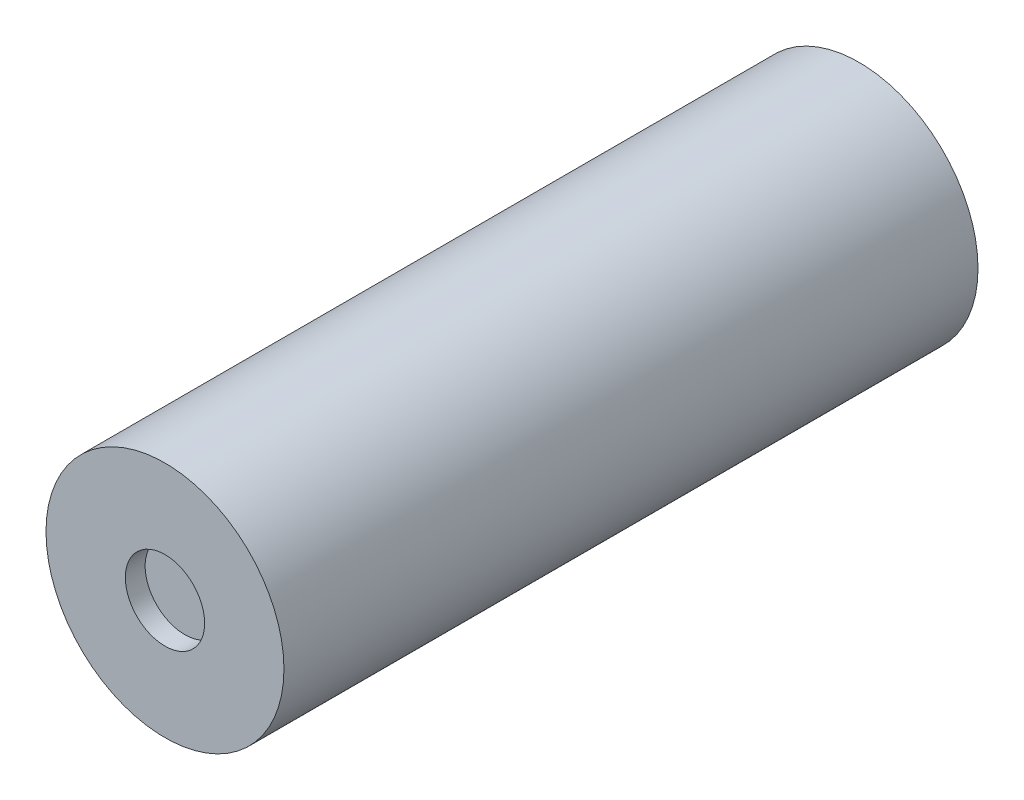
ISO-10303-21;
HEADER;
FILE_DESCRIPTION(('STEP AP214'),'2;1');
FILE_NAME('part.step','',(''),(''),'','','');
FILE_SCHEMA(('AUTOMOTIVE_DESIGN { 1 0 10303 214 1 1 1 1 }'));
ENDSEC;
DATA;
#1=APPLICATION_CONTEXT('core data for automotive mechanical design processes');
#2=APPLICATION_PROTOCOL_DEFINITION('international standard','automotive_design',2000,#1);
#3=PRODUCT_CONTEXT('',#1,'mechanical');
#4=PRODUCT('Part','Part','',(#3));
#5=PRODUCT_RELATED_PRODUCT_CATEGORY('part','',(#4));
#6=PRODUCT_DEFINITION_FORMATION('','',#4);
#7=PRODUCT_DEFINITION_CONTEXT('part definition',#1,'design');
#8=PRODUCT_DEFINITION('design','',#6,#7);
#9=PRODUCT_DEFINITION_SHAPE('','',#8);
#10=(LENGTH_UNIT() NAMED_UNIT(*) SI_UNIT(.MILLI.,.METRE.));
#11=(NAMED_UNIT(*) PLANE_ANGLE_UNIT() SI_UNIT($,.RADIAN.));
#12=(NAMED_UNIT(*) SI_UNIT($,.STERADIAN.) SOLID_ANGLE_UNIT());
#13=UNCERTAINTY_MEASURE_WITH_UNIT(LENGTH_MEASURE(1.E-05),#10,'distance_accuracy_value','');
#14=(GEOMETRIC_REPRESENTATION_CONTEXT(3) GLOBAL_UNCERTAINTY_ASSIGNED_CONTEXT((#13)) GLOBAL_UNIT_ASSIGNED_CONTEXT((#10,
#11,#12)) REPRESENTATION_CONTEXT('',''));
#15=CARTESIAN_POINT('',(0.,0.,0.));
#16=DIRECTION('',(0.,0.,1.));
#17=DIRECTION('',(1.,0.,0.));
#18=AXIS2_PLACEMENT_3D('',#15,#16,#17);
#19=CARTESIAN_POINT('',(0.,0.,104.783439490446));
#20=DIRECTION('',(0.,0.,-1.));
#21=DIRECTION('',(-1.,0.,0.));
#22=AXIS2_PLACEMENT_3D('',#19,#20,#21);
#23=CYLINDRICAL_SURFACE('',#22,6.);
#24=CARTESIAN_POINT('',(0.,0.,104.783439490446));
#25=DIRECTION('',(0.,0.,1.));
#26=DIRECTION('',(1.,0.,0.));
#27=AXIS2_PLACEMENT_3D('',#24,#25,#26);
#28=CIRCLE('',#27,6.);
#29=CARTESIAN_POINT('',(6.,0.,104.783439490446));
#30=VERTEX_POINT('',#29);
#31=EDGE_CURVE('E10',#30,#30,#28,.T.);
#32=ORIENTED_EDGE('',*,*,#31,.F.);
#33=EDGE_LOOP('',(#32));
#34=FACE_BOUND('',#33,.T.);
#35=CARTESIAN_POINT('',(0.,0.,69.7834394904459));
#36=DIRECTION('',(0.,0.,1.));
#37=DIRECTION('',(1.,0.,0.));
#38=AXIS2_PLACEMENT_3D('',#35,#36,#37);
#39=CIRCLE('',#38,6.);
#40=CARTESIAN_POINT('',(6.,0.,69.7834394904459));
#41=VERTEX_POINT('',#40);
#42=EDGE_CURVE('E48',#41,#41,#39,.T.);
#43=ORIENTED_EDGE('',*,*,#42,.T.);
#44=EDGE_LOOP('',(#43));
#45=FACE_BOUND('',#44,.T.);
#46=ADVANCED_FACE('F45',(#34,#45),#23,.T.);
#47=CARTESIAN_POINT('',(0.,0.,104.783439490446));
#48=DIRECTION('',(0.,0.,1.));
#49=DIRECTION('',(1.,0.,0.));
#50=AXIS2_PLACEMENT_3D('',#47,#48,#49);
#51=PLANE('',#50);
#52=CARTESIAN_POINT('',(0.,0.,104.783439490446));
#53=DIRECTION('',(0.,0.,1.));
#54=DIRECTION('',(1.,0.,0.));
#55=AXIS2_PLACEMENT_3D('',#52,#53,#54);
#56=CIRCLE('',#55,2.);
#57=CARTESIAN_POINT('',(2.,0.,104.783439490446));
#58=VERTEX_POINT('',#57);
#59=EDGE_CURVE('E59',#58,#58,#56,.T.);
#60=ORIENTED_EDGE('',*,*,#59,.F.);
#61=EDGE_LOOP('',(#60));
#62=FACE_BOUND('',#61,.T.);
#63=ORIENTED_EDGE('',*,*,#31,.T.);
#64=EDGE_LOOP('',(#63));
#65=FACE_BOUND('',#64,.T.);
#66=ADVANCED_FACE('F76',(#62,#65),#51,.T.);
#67=CARTESIAN_POINT('',(0.,0.,69.7834394904459));
#68=DIRECTION('',(0.,0.,1.));
#69=DIRECTION('',(1.,0.,0.));
#70=AXIS2_PLACEMENT_3D('',#67,#68,#69);
#71=PLANE('',#70);
#72=ORIENTED_EDGE('',*,*,#42,.F.);
#73=EDGE_LOOP('',(#72));
#74=FACE_BOUND('',#73,.T.);
#75=ADVANCED_FACE('F72',(#74),#71,.F.);
#76=CARTESIAN_POINT('',(0.,0.,103.783439490446));
#77=DIRECTION('',(0.,0.,1.));
#78=DIRECTION('',(1.,0.,0.));
#79=AXIS2_PLACEMENT_3D('',#76,#77,#78);
#80=CYLINDRICAL_SURFACE('',#79,2.);
#81=CARTESIAN_POINT('',(0.,0.,103.783439490446));
#82=DIRECTION('',(0.,0.,1.));
#83=DIRECTION('',(1.,0.,0.));
#84=AXIS2_PLACEMENT_3D('',#81,#82,#83);
#85=CIRCLE('',#84,2.);
#86=CARTESIAN_POINT('',(2.,0.,103.783439490446));
#87=VERTEX_POINT('',#86);
#88=EDGE_CURVE('E57',#87,#87,#85,.T.);
#89=ORIENTED_EDGE('',*,*,#88,.F.);
#90=EDGE_LOOP('',(#89));
#91=FACE_BOUND('',#90,.T.);
#92=ORIENTED_EDGE('',*,*,#59,.T.);
#93=EDGE_LOOP('',(#92));
#94=FACE_BOUND('',#93,.T.);
#95=ADVANCED_FACE('F69',(#91,#94),#80,.F.);
#96=CARTESIAN_POINT('',(0.,0.,103.783439490446));
#97=DIRECTION('',(0.,0.,1.));
#98=DIRECTION('',(1.,0.,0.));
#99=AXIS2_PLACEMENT_3D('',#96,#97,#98);
#100=PLANE('',#99);
#101=ORIENTED_EDGE('',*,*,#88,.T.);
#102=EDGE_LOOP('',(#101));
#103=FACE_BOUND('',#102,.T.);
#104=ADVANCED_FACE('F67',(#103),#100,.T.);
#105=CLOSED_SHELL('',(#46,#66,#75,#95,#104));
#106=MANIFOLD_SOLID_BREP('B2',#105);
#107=ADVANCED_BREP_SHAPE_REPRESENTATION('',(#18,#106),#14);
#108=SHAPE_DEFINITION_REPRESENTATION(#9,#107);
ENDSEC;
END-ISO-10303-21;
